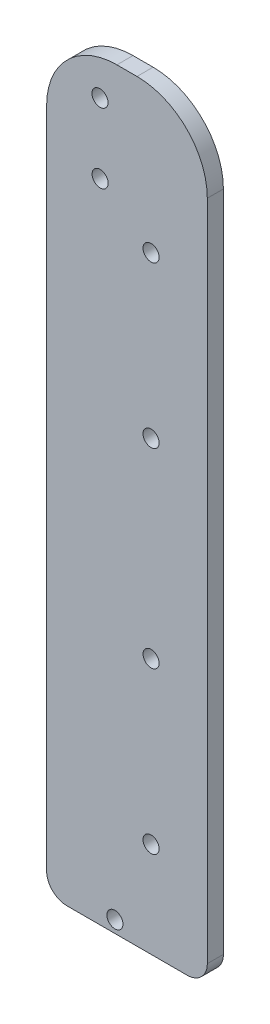
ISO-10303-21;
HEADER;
FILE_DESCRIPTION(('STEP AP214'),'2;1');
FILE_NAME('part.step','',(''),(''),'','','');
FILE_SCHEMA(('AUTOMOTIVE_DESIGN { 1 0 10303 214 1 1 1 1 }'));
ENDSEC;
DATA;
#1=APPLICATION_CONTEXT('core data for automotive mechanical design processes');
#2=APPLICATION_PROTOCOL_DEFINITION('international standard','automotive_design',2000,#1);
#3=PRODUCT_CONTEXT('',#1,'mechanical');
#4=PRODUCT('Part','Part','',(#3));
#5=PRODUCT_RELATED_PRODUCT_CATEGORY('part','',(#4));
#6=PRODUCT_DEFINITION_FORMATION('','',#4);
#7=PRODUCT_DEFINITION_CONTEXT('part definition',#1,'design');
#8=PRODUCT_DEFINITION('design','',#6,#7);
#9=PRODUCT_DEFINITION_SHAPE('','',#8);
#10=(LENGTH_UNIT() NAMED_UNIT(*) SI_UNIT(.MILLI.,.METRE.));
#11=(NAMED_UNIT(*) PLANE_ANGLE_UNIT() SI_UNIT($,.RADIAN.));
#12=(NAMED_UNIT(*) SI_UNIT($,.STERADIAN.) SOLID_ANGLE_UNIT());
#13=UNCERTAINTY_MEASURE_WITH_UNIT(LENGTH_MEASURE(1.E-05),#10,'distance_accuracy_value','');
#14=(GEOMETRIC_REPRESENTATION_CONTEXT(3) GLOBAL_UNCERTAINTY_ASSIGNED_CONTEXT((#13)) GLOBAL_UNIT_ASSIGNED_CONTEXT((#10,
#11,#12)) REPRESENTATION_CONTEXT('',''));
#15=CARTESIAN_POINT('',(0.,0.,0.));
#16=DIRECTION('',(0.,0.,1.));
#17=DIRECTION('',(1.,0.,0.));
#18=AXIS2_PLACEMENT_3D('',#15,#16,#17);
#19=CARTESIAN_POINT('',(5.08,5.08,4.064));
#20=DIRECTION('',(0.,0.,-1.));
#21=DIRECTION('',(-1.,0.,0.));
#22=AXIS2_PLACEMENT_3D('',#19,#20,#21);
#23=PLANE('',#22);
#24=DIRECTION('',(1.,0.,0.));
#25=VECTOR('',#24,1.);
#26=CARTESIAN_POINT('',(26.416,0.,4.064));
#27=LINE('',#26,#25);
#28=CARTESIAN_POINT('',(5.08000000000001,0.,4.064));
#29=VERTEX_POINT('',#28);
#30=CARTESIAN_POINT('',(35.56,0.,4.064));
#31=VERTEX_POINT('',#30);
#32=EDGE_CURVE('E98',#29,#31,#27,.T.);
#33=ORIENTED_EDGE('',*,*,#32,.T.);
#34=CARTESIAN_POINT('',(35.56,5.08,4.064));
#35=DIRECTION('',(0.,0.,1.));
#36=DIRECTION('',(1.,0.,0.));
#37=AXIS2_PLACEMENT_3D('',#34,#35,#36);
#38=CIRCLE('',#37,5.08);
#39=CARTESIAN_POINT('',(40.64,5.08,4.064));
#40=VERTEX_POINT('',#39);
#41=EDGE_CURVE('E183',#31,#40,#38,.T.);
#42=ORIENTED_EDGE('',*,*,#41,.T.);
#43=DIRECTION('',(0.,1.,0.));
#44=VECTOR('',#43,1.);
#45=CARTESIAN_POINT('',(40.64,5.08000000000004,4.064));
#46=LINE('',#45,#44);
#47=CARTESIAN_POINT('',(40.64,172.72,4.064));
#48=VERTEX_POINT('',#47);
#49=EDGE_CURVE('E166',#40,#48,#46,.T.);
#50=ORIENTED_EDGE('',*,*,#49,.T.);
#51=CARTESIAN_POINT('',(22.86,172.72,4.064));
#52=DIRECTION('',(0.,0.,1.));
#53=DIRECTION('',(1.,0.,0.));
#54=AXIS2_PLACEMENT_3D('',#51,#52,#53);
#55=CIRCLE('',#54,17.78);
#56=CARTESIAN_POINT('',(22.86,190.5,4.064));
#57=VERTEX_POINT('',#56);
#58=EDGE_CURVE('E179',#48,#57,#55,.T.);
#59=ORIENTED_EDGE('',*,*,#58,.T.);
#60=DIRECTION('',(-1.,0.,0.));
#61=VECTOR('',#60,1.);
#62=CARTESIAN_POINT('',(17.78,190.5,4.064));
#63=LINE('',#62,#61);
#64=CARTESIAN_POINT('',(17.78,190.5,4.064));
#65=VERTEX_POINT('',#64);
#66=EDGE_CURVE('E118',#57,#65,#63,.T.);
#67=ORIENTED_EDGE('',*,*,#66,.T.);
#68=CARTESIAN_POINT('',(17.78,172.72,4.064));
#69=DIRECTION('',(0.,0.,1.));
#70=DIRECTION('',(-1.,0.,0.));
#71=AXIS2_PLACEMENT_3D('',#68,#69,#70);
#72=CIRCLE('',#71,17.78);
#73=CARTESIAN_POINT('',(0.,172.72,4.064));
#74=VERTEX_POINT('',#73);
#75=EDGE_CURVE('E112',#65,#74,#72,.T.);
#76=ORIENTED_EDGE('',*,*,#75,.T.);
#77=DIRECTION('',(0.,-1.,0.));
#78=VECTOR('',#77,1.);
#79=CARTESIAN_POINT('',(0.,5.08000000000003,4.064));
#80=LINE('',#79,#78);
#81=CARTESIAN_POINT('',(0.,5.08000000000003,4.064));
#82=VERTEX_POINT('',#81);
#83=EDGE_CURVE('E116',#74,#82,#80,.T.);
#84=ORIENTED_EDGE('',*,*,#83,.T.);
#85=CARTESIAN_POINT('',(5.08,5.08,4.064));
#86=DIRECTION('',(0.,0.,1.));
#87=DIRECTION('',(-1.,0.,0.));
#88=AXIS2_PLACEMENT_3D('',#85,#86,#87);
#89=CIRCLE('',#88,5.08000000000002);
#90=EDGE_CURVE('E56',#82,#29,#89,.T.);
#91=ORIENTED_EDGE('',*,*,#90,.T.);
#92=EDGE_LOOP('',(#33,#42,#50,#59,#67,#76,#84,#91));
#93=FACE_BOUND('',#92,.T.);
#94=CARTESIAN_POINT('',(26.416,24.13,4.064));
#95=DIRECTION('',(0.,0.,1.));
#96=DIRECTION('',(1.,0.,0.));
#97=AXIS2_PLACEMENT_3D('',#94,#95,#96);
#98=CIRCLE('',#97,2.032);
#99=CARTESIAN_POINT('',(28.448,24.13,4.064));
#100=VERTEX_POINT('',#99);
#101=EDGE_CURVE('E138',#100,#100,#98,.T.);
#102=ORIENTED_EDGE('',*,*,#101,.F.);
#103=EDGE_LOOP('',(#102));
#104=FACE_BOUND('',#103,.T.);
#105=CARTESIAN_POINT('',(26.416,64.77,4.064));
#106=DIRECTION('',(0.,0.,1.));
#107=DIRECTION('',(1.,0.,0.));
#108=AXIS2_PLACEMENT_3D('',#105,#106,#107);
#109=CIRCLE('',#108,2.032);
#110=CARTESIAN_POINT('',(28.448,64.77,4.064));
#111=VERTEX_POINT('',#110);
#112=EDGE_CURVE('E189',#111,#111,#109,.T.);
#113=ORIENTED_EDGE('',*,*,#112,.F.);
#114=EDGE_LOOP('',(#113));
#115=FACE_BOUND('',#114,.T.);
#116=CARTESIAN_POINT('',(17.272,3.04799999999999,4.064));
#117=DIRECTION('',(0.,0.,1.));
#118=DIRECTION('',(1.,0.,0.));
#119=AXIS2_PLACEMENT_3D('',#116,#117,#118);
#120=CIRCLE('',#119,2.032);
#121=CARTESIAN_POINT('',(19.304,3.04799999999999,4.064));
#122=VERTEX_POINT('',#121);
#123=EDGE_CURVE('E195',#122,#122,#120,.T.);
#124=ORIENTED_EDGE('',*,*,#123,.F.);
#125=EDGE_LOOP('',(#124));
#126=FACE_BOUND('',#125,.T.);
#127=CARTESIAN_POINT('',(26.416,113.03,4.064));
#128=DIRECTION('',(0.,0.,1.));
#129=DIRECTION('',(1.,0.,0.));
#130=AXIS2_PLACEMENT_3D('',#127,#128,#129);
#131=CIRCLE('',#130,2.03200000000001);
#132=CARTESIAN_POINT('',(28.448,113.03,4.064));
#133=VERTEX_POINT('',#132);
#134=EDGE_CURVE('E201',#133,#133,#131,.T.);
#135=ORIENTED_EDGE('',*,*,#134,.F.);
#136=EDGE_LOOP('',(#135));
#137=FACE_BOUND('',#136,.T.);
#138=CARTESIAN_POINT('',(26.416,153.67,4.064));
#139=DIRECTION('',(0.,0.,1.));
#140=DIRECTION('',(1.,0.,0.));
#141=AXIS2_PLACEMENT_3D('',#138,#139,#140);
#142=CIRCLE('',#141,2.032);
#143=CARTESIAN_POINT('',(28.448,153.67,4.064));
#144=VERTEX_POINT('',#143);
#145=EDGE_CURVE('E207',#144,#144,#142,.T.);
#146=ORIENTED_EDGE('',*,*,#145,.F.);
#147=EDGE_LOOP('',(#146));
#148=FACE_BOUND('',#147,.T.);
#149=CARTESIAN_POINT('',(13.4925297917187,181.102,4.064));
#150=DIRECTION('',(0.,0.,1.));
#151=DIRECTION('',(1.,0.,0.));
#152=AXIS2_PLACEMENT_3D('',#149,#150,#151);
#153=CIRCLE('',#152,2.03199999999999);
#154=CARTESIAN_POINT('',(15.5245297917187,181.102,4.064));
#155=VERTEX_POINT('',#154);
#156=EDGE_CURVE('E213',#155,#155,#153,.T.);
#157=ORIENTED_EDGE('',*,*,#156,.F.);
#158=EDGE_LOOP('',(#157));
#159=FACE_BOUND('',#158,.T.);
#160=CARTESIAN_POINT('',(13.5310455618775,163.449,4.064));
#161=DIRECTION('',(0.,0.,1.));
#162=DIRECTION('',(1.,0.,0.));
#163=AXIS2_PLACEMENT_3D('',#160,#161,#162);
#164=CIRCLE('',#163,2.03199999999999);
#165=CARTESIAN_POINT('',(15.5630455618775,163.449,4.064));
#166=VERTEX_POINT('',#165);
#167=EDGE_CURVE('E219',#166,#166,#164,.T.);
#168=ORIENTED_EDGE('',*,*,#167,.F.);
#169=EDGE_LOOP('',(#168));
#170=FACE_BOUND('',#169,.T.);
#171=ADVANCED_FACE('F39',(#93,#104,#115,#126,#137,#148,#159,#170),#23,.F.);
#172=CARTESIAN_POINT('',(5.08,5.08,0.));
#173=DIRECTION('',(0.,0.,-1.));
#174=DIRECTION('',(-1.,0.,0.));
#175=AXIS2_PLACEMENT_3D('',#172,#173,#174);
#176=PLANE('',#175);
#177=CARTESIAN_POINT('',(13.4925297917187,181.102,0.));
#178=DIRECTION('',(0.,0.,1.));
#179=DIRECTION('',(1.,0.,0.));
#180=AXIS2_PLACEMENT_3D('',#177,#178,#179);
#181=CIRCLE('',#180,2.03199999999999);
#182=CARTESIAN_POINT('',(15.5245297917187,181.102,0.));
#183=VERTEX_POINT('',#182);
#184=EDGE_CURVE('E216',#183,#183,#181,.T.);
#185=ORIENTED_EDGE('',*,*,#184,.T.);
#186=EDGE_LOOP('',(#185));
#187=FACE_BOUND('',#186,.T.);
#188=CARTESIAN_POINT('',(26.416,113.03,0.));
#189=DIRECTION('',(0.,0.,1.));
#190=DIRECTION('',(1.,0.,0.));
#191=AXIS2_PLACEMENT_3D('',#188,#189,#190);
#192=CIRCLE('',#191,2.03200000000001);
#193=CARTESIAN_POINT('',(28.448,113.03,0.));
#194=VERTEX_POINT('',#193);
#195=EDGE_CURVE('E204',#194,#194,#192,.T.);
#196=ORIENTED_EDGE('',*,*,#195,.T.);
#197=EDGE_LOOP('',(#196));
#198=FACE_BOUND('',#197,.T.);
#199=CARTESIAN_POINT('',(26.416,64.77,0.));
#200=DIRECTION('',(0.,0.,1.));
#201=DIRECTION('',(1.,0.,0.));
#202=AXIS2_PLACEMENT_3D('',#199,#200,#201);
#203=CIRCLE('',#202,2.032);
#204=CARTESIAN_POINT('',(28.448,64.77,0.));
#205=VERTEX_POINT('',#204);
#206=EDGE_CURVE('E192',#205,#205,#203,.T.);
#207=ORIENTED_EDGE('',*,*,#206,.T.);
#208=EDGE_LOOP('',(#207));
#209=FACE_BOUND('',#208,.T.);
#210=DIRECTION('',(1.,0.,0.));
#211=VECTOR('',#210,1.);
#212=CARTESIAN_POINT('',(35.56,0.,0.));
#213=LINE('',#212,#211);
#214=CARTESIAN_POINT('',(5.08000000000001,0.,0.));
#215=VERTEX_POINT('',#214);
#216=CARTESIAN_POINT('',(35.56,0.,0.));
#217=VERTEX_POINT('',#216);
#218=EDGE_CURVE('E92',#215,#217,#213,.T.);
#219=ORIENTED_EDGE('',*,*,#218,.F.);
#220=CARTESIAN_POINT('',(5.08,5.08,0.));
#221=DIRECTION('',(0.,0.,1.));
#222=DIRECTION('',(-1.,0.,0.));
#223=AXIS2_PLACEMENT_3D('',#220,#221,#222);
#224=CIRCLE('',#223,5.08000000000002);
#225=CARTESIAN_POINT('',(0.,5.08000000000003,0.));
#226=VERTEX_POINT('',#225);
#227=EDGE_CURVE('E148',#226,#215,#224,.T.);
#228=ORIENTED_EDGE('',*,*,#227,.F.);
#229=DIRECTION('',(0.,-1.,0.));
#230=VECTOR('',#229,1.);
#231=CARTESIAN_POINT('',(0.,5.08000000000003,0.));
#232=LINE('',#231,#230);
#233=CARTESIAN_POINT('',(0.,172.72,0.));
#234=VERTEX_POINT('',#233);
#235=EDGE_CURVE('E85',#234,#226,#232,.T.);
#236=ORIENTED_EDGE('',*,*,#235,.F.);
#237=CARTESIAN_POINT('',(17.78,172.72,0.));
#238=DIRECTION('',(0.,0.,1.));
#239=DIRECTION('',(-1.,0.,0.));
#240=AXIS2_PLACEMENT_3D('',#237,#238,#239);
#241=CIRCLE('',#240,17.78);
#242=CARTESIAN_POINT('',(17.78,190.5,0.));
#243=VERTEX_POINT('',#242);
#244=EDGE_CURVE('E126',#243,#234,#241,.T.);
#245=ORIENTED_EDGE('',*,*,#244,.F.);
#246=DIRECTION('',(-1.,0.,0.));
#247=VECTOR('',#246,1.);
#248=CARTESIAN_POINT('',(17.78,190.5,0.));
#249=LINE('',#248,#247);
#250=CARTESIAN_POINT('',(22.86,190.5,0.));
#251=VERTEX_POINT('',#250);
#252=EDGE_CURVE('E144',#251,#243,#249,.T.);
#253=ORIENTED_EDGE('',*,*,#252,.F.);
#254=CARTESIAN_POINT('',(22.86,172.72,0.));
#255=DIRECTION('',(0.,0.,1.));
#256=DIRECTION('',(1.,0.,0.));
#257=AXIS2_PLACEMENT_3D('',#254,#255,#256);
#258=CIRCLE('',#257,17.78);
#259=CARTESIAN_POINT('',(40.64,172.72,0.));
#260=VERTEX_POINT('',#259);
#261=EDGE_CURVE('E142',#260,#251,#258,.T.);
#262=ORIENTED_EDGE('',*,*,#261,.F.);
#263=DIRECTION('',(0.,1.,0.));
#264=VECTOR('',#263,1.);
#265=CARTESIAN_POINT('',(40.64,5.08000000000004,0.));
#266=LINE('',#265,#264);
#267=CARTESIAN_POINT('',(40.64,5.08,0.));
#268=VERTEX_POINT('',#267);
#269=EDGE_CURVE('E140',#268,#260,#266,.T.);
#270=ORIENTED_EDGE('',*,*,#269,.F.);
#271=CARTESIAN_POINT('',(35.56,5.08,0.));
#272=DIRECTION('',(0.,0.,1.));
#273=DIRECTION('',(1.,0.,0.));
#274=AXIS2_PLACEMENT_3D('',#271,#272,#273);
#275=CIRCLE('',#274,5.08);
#276=EDGE_CURVE('E137',#217,#268,#275,.T.);
#277=ORIENTED_EDGE('',*,*,#276,.F.);
#278=EDGE_LOOP('',(#219,#228,#236,#245,#253,#262,#270,#277));
#279=FACE_BOUND('',#278,.T.);
#280=CARTESIAN_POINT('',(26.416,24.13,0.));
#281=DIRECTION('',(0.,0.,1.));
#282=DIRECTION('',(1.,0.,0.));
#283=AXIS2_PLACEMENT_3D('',#280,#281,#282);
#284=CIRCLE('',#283,2.032);
#285=CARTESIAN_POINT('',(28.448,24.13,0.));
#286=VERTEX_POINT('',#285);
#287=EDGE_CURVE('E186',#286,#286,#284,.T.);
#288=ORIENTED_EDGE('',*,*,#287,.T.);
#289=EDGE_LOOP('',(#288));
#290=FACE_BOUND('',#289,.T.);
#291=CARTESIAN_POINT('',(17.272,3.04799999999999,0.));
#292=DIRECTION('',(0.,0.,1.));
#293=DIRECTION('',(1.,0.,0.));
#294=AXIS2_PLACEMENT_3D('',#291,#292,#293);
#295=CIRCLE('',#294,2.032);
#296=CARTESIAN_POINT('',(19.304,3.04799999999999,0.));
#297=VERTEX_POINT('',#296);
#298=EDGE_CURVE('E198',#297,#297,#295,.T.);
#299=ORIENTED_EDGE('',*,*,#298,.T.);
#300=EDGE_LOOP('',(#299));
#301=FACE_BOUND('',#300,.T.);
#302=CARTESIAN_POINT('',(26.416,153.67,0.));
#303=DIRECTION('',(0.,0.,1.));
#304=DIRECTION('',(1.,0.,0.));
#305=AXIS2_PLACEMENT_3D('',#302,#303,#304);
#306=CIRCLE('',#305,2.032);
#307=CARTESIAN_POINT('',(28.448,153.67,0.));
#308=VERTEX_POINT('',#307);
#309=EDGE_CURVE('E210',#308,#308,#306,.T.);
#310=ORIENTED_EDGE('',*,*,#309,.T.);
#311=EDGE_LOOP('',(#310));
#312=FACE_BOUND('',#311,.T.);
#313=CARTESIAN_POINT('',(13.5310455618775,163.449,0.));
#314=DIRECTION('',(0.,0.,1.));
#315=DIRECTION('',(1.,0.,0.));
#316=AXIS2_PLACEMENT_3D('',#313,#314,#315);
#317=CIRCLE('',#316,2.03199999999999);
#318=CARTESIAN_POINT('',(15.5630455618775,163.449,0.));
#319=VERTEX_POINT('',#318);
#320=EDGE_CURVE('E222',#319,#319,#317,.T.);
#321=ORIENTED_EDGE('',*,*,#320,.T.);
#322=EDGE_LOOP('',(#321));
#323=FACE_BOUND('',#322,.T.);
#324=ADVANCED_FACE('F170',(#187,#198,#209,#279,#290,#301,#312,#323),#176,.T.);
#325=CARTESIAN_POINT('',(35.56,0.,4.064));
#326=DIRECTION('',(0.,1.,0.));
#327=DIRECTION('',(-1.,0.,0.));
#328=AXIS2_PLACEMENT_3D('',#325,#326,#327);
#329=PLANE('',#328);
#330=ORIENTED_EDGE('',*,*,#218,.T.);
#331=DIRECTION('',(0.,0.,-1.));
#332=VECTOR('',#331,1.);
#333=CARTESIAN_POINT('',(35.56,0.,4.064));
#334=LINE('',#333,#332);
#335=EDGE_CURVE('E11',#31,#217,#334,.T.);
#336=ORIENTED_EDGE('',*,*,#335,.F.);
#337=ORIENTED_EDGE('',*,*,#32,.F.);
#338=DIRECTION('',(0.,0.,-1.));
#339=VECTOR('',#338,1.);
#340=CARTESIAN_POINT('',(5.08000000000001,0.,4.064));
#341=LINE('',#340,#339);
#342=EDGE_CURVE('E132',#29,#215,#341,.T.);
#343=ORIENTED_EDGE('',*,*,#342,.T.);
#344=EDGE_LOOP('',(#330,#336,#337,#343));
#345=FACE_BOUND('',#344,.T.);
#346=ADVANCED_FACE('F41',(#345),#329,.F.);
#347=CARTESIAN_POINT('',(35.56,5.08,4.064));
#348=DIRECTION('',(0.,0.,-1.));
#349=DIRECTION('',(-1.,0.,0.));
#350=AXIS2_PLACEMENT_3D('',#347,#348,#349);
#351=CYLINDRICAL_SURFACE('',#350,5.08);
#352=ORIENTED_EDGE('',*,*,#276,.T.);
#353=DIRECTION('',(0.,0.,-1.));
#354=VECTOR('',#353,1.);
#355=CARTESIAN_POINT('',(40.64,5.08,4.064));
#356=LINE('',#355,#354);
#357=EDGE_CURVE('E48',#40,#268,#356,.T.);
#358=ORIENTED_EDGE('',*,*,#357,.F.);
#359=ORIENTED_EDGE('',*,*,#41,.F.);
#360=ORIENTED_EDGE('',*,*,#335,.T.);
#361=EDGE_LOOP('',(#352,#358,#359,#360));
#362=FACE_BOUND('',#361,.T.);
#363=ADVANCED_FACE('F255',(#362),#351,.T.);
#364=CARTESIAN_POINT('',(40.64,5.08000000000004,4.064));
#365=DIRECTION('',(-1.,0.,0.));
#366=DIRECTION('',(0.,-1.,0.));
#367=AXIS2_PLACEMENT_3D('',#364,#365,#366);
#368=PLANE('',#367);
#369=ORIENTED_EDGE('',*,*,#269,.T.);
#370=DIRECTION('',(0.,0.,-1.));
#371=VECTOR('',#370,1.);
#372=CARTESIAN_POINT('',(40.64,172.72,4.064));
#373=LINE('',#372,#371);
#374=EDGE_CURVE('E157',#48,#260,#373,.T.);
#375=ORIENTED_EDGE('',*,*,#374,.F.);
#376=ORIENTED_EDGE('',*,*,#49,.F.);
#377=ORIENTED_EDGE('',*,*,#357,.T.);
#378=EDGE_LOOP('',(#369,#375,#376,#377));
#379=FACE_BOUND('',#378,.T.);
#380=ADVANCED_FACE('F164',(#379),#368,.F.);
#381=CARTESIAN_POINT('',(22.86,172.72,4.064));
#382=DIRECTION('',(0.,0.,-1.));
#383=DIRECTION('',(-1.,0.,0.));
#384=AXIS2_PLACEMENT_3D('',#381,#382,#383);
#385=CYLINDRICAL_SURFACE('',#384,17.78);
#386=ORIENTED_EDGE('',*,*,#261,.T.);
#387=DIRECTION('',(0.,0.,-1.));
#388=VECTOR('',#387,1.);
#389=CARTESIAN_POINT('',(22.86,190.5,4.064));
#390=LINE('',#389,#388);
#391=EDGE_CURVE('E154',#57,#251,#390,.T.);
#392=ORIENTED_EDGE('',*,*,#391,.F.);
#393=ORIENTED_EDGE('',*,*,#58,.F.);
#394=ORIENTED_EDGE('',*,*,#374,.T.);
#395=EDGE_LOOP('',(#386,#392,#393,#394));
#396=FACE_BOUND('',#395,.T.);
#397=ADVANCED_FACE('F175',(#396),#385,.T.);
#398=CARTESIAN_POINT('',(17.78,190.5,4.064));
#399=DIRECTION('',(0.,-1.,0.));
#400=DIRECTION('',(0.,0.,-1.));
#401=AXIS2_PLACEMENT_3D('',#398,#399,#400);
#402=PLANE('',#401);
#403=ORIENTED_EDGE('',*,*,#252,.T.);
#404=DIRECTION('',(0.,0.,-1.));
#405=VECTOR('',#404,1.);
#406=CARTESIAN_POINT('',(17.78,190.5,4.064));
#407=LINE('',#406,#405);
#408=EDGE_CURVE('E127',#65,#243,#407,.T.);
#409=ORIENTED_EDGE('',*,*,#408,.F.);
#410=ORIENTED_EDGE('',*,*,#66,.F.);
#411=ORIENTED_EDGE('',*,*,#391,.T.);
#412=EDGE_LOOP('',(#403,#409,#410,#411));
#413=FACE_BOUND('',#412,.T.);
#414=ADVANCED_FACE('F178',(#413),#402,.F.);
#415=CARTESIAN_POINT('',(17.78,172.72,4.064));
#416=DIRECTION('',(0.,0.,-1.));
#417=DIRECTION('',(-1.,0.,0.));
#418=AXIS2_PLACEMENT_3D('',#415,#416,#417);
#419=CYLINDRICAL_SURFACE('',#418,17.78);
#420=ORIENTED_EDGE('',*,*,#244,.T.);
#421=DIRECTION('',(0.,0.,-1.));
#422=VECTOR('',#421,1.);
#423=CARTESIAN_POINT('',(0.,172.72,4.064));
#424=LINE('',#423,#422);
#425=EDGE_CURVE('E123',#74,#234,#424,.T.);
#426=ORIENTED_EDGE('',*,*,#425,.F.);
#427=ORIENTED_EDGE('',*,*,#75,.F.);
#428=ORIENTED_EDGE('',*,*,#408,.T.);
#429=EDGE_LOOP('',(#420,#426,#427,#428));
#430=FACE_BOUND('',#429,.T.);
#431=ADVANCED_FACE('F124',(#430),#419,.T.);
#432=CARTESIAN_POINT('',(0.,5.08000000000003,4.064));
#433=DIRECTION('',(1.,0.,0.));
#434=DIRECTION('',(0.,0.,-1.));
#435=AXIS2_PLACEMENT_3D('',#432,#433,#434);
#436=PLANE('',#435);
#437=ORIENTED_EDGE('',*,*,#235,.T.);
#438=DIRECTION('',(0.,0.,-1.));
#439=VECTOR('',#438,1.);
#440=CARTESIAN_POINT('',(0.,5.08000000000003,4.064));
#441=LINE('',#440,#439);
#442=EDGE_CURVE('E128',#82,#226,#441,.T.);
#443=ORIENTED_EDGE('',*,*,#442,.F.);
#444=ORIENTED_EDGE('',*,*,#83,.F.);
#445=ORIENTED_EDGE('',*,*,#425,.T.);
#446=EDGE_LOOP('',(#437,#443,#444,#445));
#447=FACE_BOUND('',#446,.T.);
#448=ADVANCED_FACE('F130',(#447),#436,.F.);
#449=CARTESIAN_POINT('',(5.08,5.08,4.064));
#450=DIRECTION('',(0.,0.,-1.));
#451=DIRECTION('',(-1.,0.,0.));
#452=AXIS2_PLACEMENT_3D('',#449,#450,#451);
#453=CYLINDRICAL_SURFACE('',#452,5.08000000000002);
#454=ORIENTED_EDGE('',*,*,#227,.T.);
#455=ORIENTED_EDGE('',*,*,#342,.F.);
#456=ORIENTED_EDGE('',*,*,#90,.F.);
#457=ORIENTED_EDGE('',*,*,#442,.T.);
#458=EDGE_LOOP('',(#454,#455,#456,#457));
#459=FACE_BOUND('',#458,.T.);
#460=ADVANCED_FACE('F242',(#459),#453,.T.);
#461=CARTESIAN_POINT('',(26.416,24.13,4.064));
#462=DIRECTION('',(0.,0.,-1.));
#463=DIRECTION('',(-1.,0.,0.));
#464=AXIS2_PLACEMENT_3D('',#461,#462,#463);
#465=CYLINDRICAL_SURFACE('',#464,2.032);
#466=ORIENTED_EDGE('',*,*,#101,.T.);
#467=EDGE_LOOP('',(#466));
#468=FACE_BOUND('',#467,.T.);
#469=ORIENTED_EDGE('',*,*,#287,.F.);
#470=EDGE_LOOP('',(#469));
#471=FACE_BOUND('',#470,.T.);
#472=ADVANCED_FACE('F239',(#468,#471),#465,.F.);
#473=CARTESIAN_POINT('',(26.416,64.77,4.064));
#474=DIRECTION('',(0.,0.,-1.));
#475=DIRECTION('',(-1.,0.,0.));
#476=AXIS2_PLACEMENT_3D('',#473,#474,#475);
#477=CYLINDRICAL_SURFACE('',#476,2.032);
#478=ORIENTED_EDGE('',*,*,#112,.T.);
#479=EDGE_LOOP('',(#478));
#480=FACE_BOUND('',#479,.T.);
#481=ORIENTED_EDGE('',*,*,#206,.F.);
#482=EDGE_LOOP('',(#481));
#483=FACE_BOUND('',#482,.T.);
#484=ADVANCED_FACE('F319',(#480,#483),#477,.F.);
#485=CARTESIAN_POINT('',(17.272,3.04799999999999,4.064));
#486=DIRECTION('',(0.,0.,-1.));
#487=DIRECTION('',(-1.,0.,0.));
#488=AXIS2_PLACEMENT_3D('',#485,#486,#487);
#489=CYLINDRICAL_SURFACE('',#488,2.032);
#490=ORIENTED_EDGE('',*,*,#123,.T.);
#491=EDGE_LOOP('',(#490));
#492=FACE_BOUND('',#491,.T.);
#493=ORIENTED_EDGE('',*,*,#298,.F.);
#494=EDGE_LOOP('',(#493));
#495=FACE_BOUND('',#494,.T.);
#496=ADVANCED_FACE('F327',(#492,#495),#489,.F.);
#497=CARTESIAN_POINT('',(26.416,113.03,4.064));
#498=DIRECTION('',(0.,0.,-1.));
#499=DIRECTION('',(-1.,0.,0.));
#500=AXIS2_PLACEMENT_3D('',#497,#498,#499);
#501=CYLINDRICAL_SURFACE('',#500,2.03200000000001);
#502=ORIENTED_EDGE('',*,*,#134,.T.);
#503=EDGE_LOOP('',(#502));
#504=FACE_BOUND('',#503,.T.);
#505=ORIENTED_EDGE('',*,*,#195,.F.);
#506=EDGE_LOOP('',(#505));
#507=FACE_BOUND('',#506,.T.);
#508=ADVANCED_FACE('F335',(#504,#507),#501,.F.);
#509=CARTESIAN_POINT('',(26.416,153.67,4.064));
#510=DIRECTION('',(0.,0.,-1.));
#511=DIRECTION('',(-1.,0.,0.));
#512=AXIS2_PLACEMENT_3D('',#509,#510,#511);
#513=CYLINDRICAL_SURFACE('',#512,2.032);
#514=ORIENTED_EDGE('',*,*,#145,.T.);
#515=EDGE_LOOP('',(#514));
#516=FACE_BOUND('',#515,.T.);
#517=ORIENTED_EDGE('',*,*,#309,.F.);
#518=EDGE_LOOP('',(#517));
#519=FACE_BOUND('',#518,.T.);
#520=ADVANCED_FACE('F344',(#516,#519),#513,.F.);
#521=CARTESIAN_POINT('',(13.4925297917187,181.102,4.064));
#522=DIRECTION('',(0.,0.,-1.));
#523=DIRECTION('',(-1.,0.,0.));
#524=AXIS2_PLACEMENT_3D('',#521,#522,#523);
#525=CYLINDRICAL_SURFACE('',#524,2.03199999999999);
#526=ORIENTED_EDGE('',*,*,#156,.T.);
#527=EDGE_LOOP('',(#526));
#528=FACE_BOUND('',#527,.T.);
#529=ORIENTED_EDGE('',*,*,#184,.F.);
#530=EDGE_LOOP('',(#529));
#531=FACE_BOUND('',#530,.T.);
#532=ADVANCED_FACE('F353',(#528,#531),#525,.F.);
#533=CARTESIAN_POINT('',(13.5310455618775,163.449,4.064));
#534=DIRECTION('',(0.,0.,-1.));
#535=DIRECTION('',(-1.,0.,0.));
#536=AXIS2_PLACEMENT_3D('',#533,#534,#535);
#537=CYLINDRICAL_SURFACE('',#536,2.03199999999999);
#538=ORIENTED_EDGE('',*,*,#167,.T.);
#539=EDGE_LOOP('',(#538));
#540=FACE_BOUND('',#539,.T.);
#541=ORIENTED_EDGE('',*,*,#320,.F.);
#542=EDGE_LOOP('',(#541));
#543=FACE_BOUND('',#542,.T.);
#544=ADVANCED_FACE('F228',(#540,#543),#537,.F.);
#545=CLOSED_SHELL('',(#171,#324,#346,#363,#380,#397,#414,#431,#448,#460,#472,#484,#496,#508,
#520,#532,#544));
#546=MANIFOLD_SOLID_BREP('B2',#545);
#547=ADVANCED_BREP_SHAPE_REPRESENTATION('',(#18,#546),#14);
#548=SHAPE_DEFINITION_REPRESENTATION(#9,#547);
ENDSEC;
END-ISO-10303-21;
